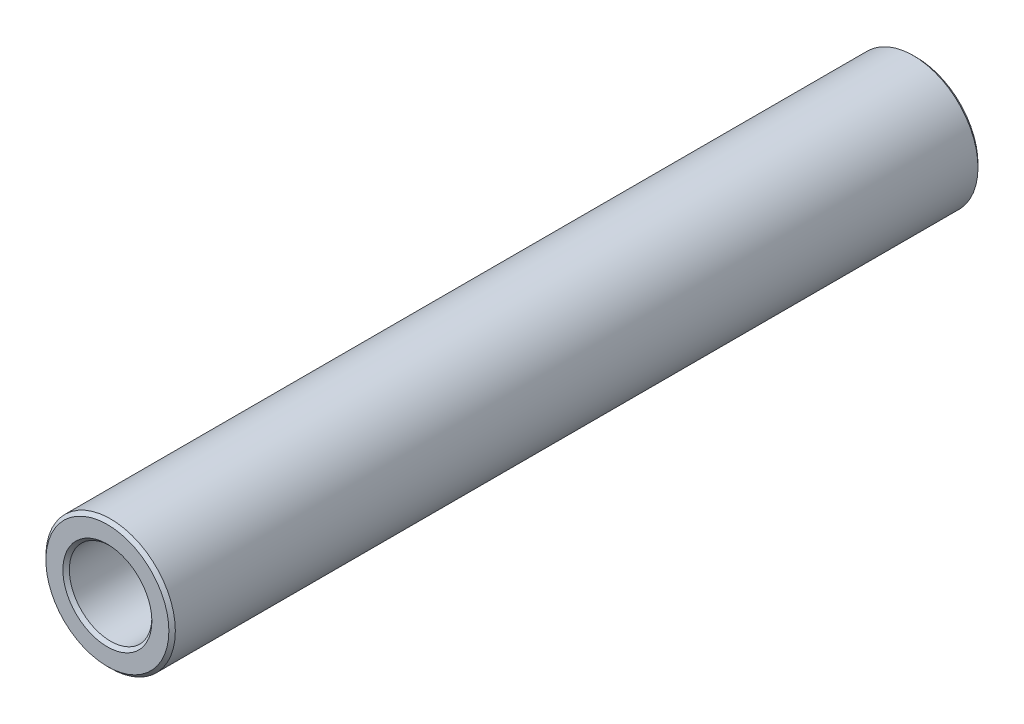
ISO-10303-21;
HEADER;
FILE_DESCRIPTION(('STEP AP214'),'2;1');
FILE_NAME('part.step','',(''),(''),'','','');
FILE_SCHEMA(('AUTOMOTIVE_DESIGN { 1 0 10303 214 1 1 1 1 }'));
ENDSEC;
DATA;
#1=APPLICATION_CONTEXT('core data for automotive mechanical design processes');
#2=APPLICATION_PROTOCOL_DEFINITION('international standard','automotive_design',2000,#1);
#3=PRODUCT_CONTEXT('',#1,'mechanical');
#4=PRODUCT('Part','Part','',(#3));
#5=PRODUCT_RELATED_PRODUCT_CATEGORY('part','',(#4));
#6=PRODUCT_DEFINITION_FORMATION('','',#4);
#7=PRODUCT_DEFINITION_CONTEXT('part definition',#1,'design');
#8=PRODUCT_DEFINITION('design','',#6,#7);
#9=PRODUCT_DEFINITION_SHAPE('','',#8);
#10=(LENGTH_UNIT() NAMED_UNIT(*) SI_UNIT(.MILLI.,.METRE.));
#11=(NAMED_UNIT(*) PLANE_ANGLE_UNIT() SI_UNIT($,.RADIAN.));
#12=(NAMED_UNIT(*) SI_UNIT($,.STERADIAN.) SOLID_ANGLE_UNIT());
#13=UNCERTAINTY_MEASURE_WITH_UNIT(LENGTH_MEASURE(1.E-05),#10,'distance_accuracy_value','');
#14=(GEOMETRIC_REPRESENTATION_CONTEXT(3) GLOBAL_UNCERTAINTY_ASSIGNED_CONTEXT((#13)) GLOBAL_UNIT_ASSIGNED_CONTEXT((#10,
#11,#12)) REPRESENTATION_CONTEXT('',''));
#15=CARTESIAN_POINT('',(0.,0.,0.));
#16=DIRECTION('',(0.,0.,1.));
#17=DIRECTION('',(1.,0.,0.));
#18=AXIS2_PLACEMENT_3D('',#15,#16,#17);
#19=CARTESIAN_POINT('',(0.,0.,50.));
#20=DIRECTION('',(0.,0.,1.));
#21=DIRECTION('',(1.,0.,0.));
#22=AXIS2_PLACEMENT_3D('',#19,#20,#21);
#23=PLANE('',#22);
#24=CARTESIAN_POINT('',(0.,0.,50.));
#25=DIRECTION('',(0.,0.,1.));
#26=DIRECTION('',(1.,0.,0.));
#27=AXIS2_PLACEMENT_3D('',#24,#25,#26);
#28=CIRCLE('',#27,2.75);
#29=CARTESIAN_POINT('',(2.75,0.,50.));
#30=VERTEX_POINT('',#29);
#31=EDGE_CURVE('E10',#30,#30,#28,.F.);
#32=ORIENTED_EDGE('',*,*,#31,.T.);
#33=EDGE_LOOP('',(#32));
#34=FACE_BOUND('',#33,.T.);
#35=CARTESIAN_POINT('',(0.,0.,50.));
#36=DIRECTION('',(0.,0.,1.));
#37=DIRECTION('',(1.,0.,0.));
#38=AXIS2_PLACEMENT_3D('',#35,#36,#37);
#39=CIRCLE('',#38,3.8);
#40=CARTESIAN_POINT('',(3.8,0.,50.));
#41=VERTEX_POINT('',#40);
#42=EDGE_CURVE('E37',#41,#41,#39,.T.);
#43=ORIENTED_EDGE('',*,*,#42,.T.);
#44=EDGE_LOOP('',(#43));
#45=FACE_BOUND('',#44,.T.);
#46=ADVANCED_FACE('F30',(#34,#45),#23,.T.);
#47=CARTESIAN_POINT('',(0.,0.,0.));
#48=DIRECTION('',(0.,0.,1.));
#49=DIRECTION('',(1.,0.,0.));
#50=AXIS2_PLACEMENT_3D('',#47,#48,#49);
#51=PLANE('',#50);
#52=CARTESIAN_POINT('',(0.,0.,0.));
#53=DIRECTION('',(0.,0.,1.));
#54=DIRECTION('',(1.,0.,0.));
#55=AXIS2_PLACEMENT_3D('',#52,#53,#54);
#56=CIRCLE('',#55,3.79999999999999);
#57=CARTESIAN_POINT('',(3.79999999999999,0.,0.));
#58=VERTEX_POINT('',#57);
#59=EDGE_CURVE('E50',#58,#58,#56,.F.);
#60=ORIENTED_EDGE('',*,*,#59,.T.);
#61=EDGE_LOOP('',(#60));
#62=FACE_BOUND('',#61,.T.);
#63=CARTESIAN_POINT('',(0.,0.,0.));
#64=DIRECTION('',(0.,0.,1.));
#65=DIRECTION('',(1.,0.,0.));
#66=AXIS2_PLACEMENT_3D('',#63,#64,#65);
#67=CIRCLE('',#66,2.75);
#68=CARTESIAN_POINT('',(2.75,0.,0.));
#69=VERTEX_POINT('',#68);
#70=EDGE_CURVE('E53',#69,#69,#67,.T.);
#71=ORIENTED_EDGE('',*,*,#70,.T.);
#72=EDGE_LOOP('',(#71));
#73=FACE_BOUND('',#72,.T.);
#74=ADVANCED_FACE('F74',(#62,#73),#51,.F.);
#75=CARTESIAN_POINT('',(0.,0.,50.));
#76=DIRECTION('',(0.,0.,-1.));
#77=DIRECTION('',(-1.,0.,0.));
#78=AXIS2_PLACEMENT_3D('',#75,#76,#77);
#79=CYLINDRICAL_SURFACE('',#78,4.);
#80=CARTESIAN_POINT('',(0.,0.,0.200000000000006));
#81=DIRECTION('',(0.,0.,1.));
#82=DIRECTION('',(1.,0.,0.));
#83=AXIS2_PLACEMENT_3D('',#80,#81,#82);
#84=CIRCLE('',#83,4.);
#85=CARTESIAN_POINT('',(4.,0.,0.200000000000006));
#86=VERTEX_POINT('',#85);
#87=EDGE_CURVE('E56',#86,#86,#84,.T.);
#88=ORIENTED_EDGE('',*,*,#87,.T.);
#89=EDGE_LOOP('',(#88));
#90=FACE_BOUND('',#89,.T.);
#91=CARTESIAN_POINT('',(0.,0.,49.8));
#92=DIRECTION('',(0.,0.,1.));
#93=DIRECTION('',(1.,0.,0.));
#94=AXIS2_PLACEMENT_3D('',#91,#92,#93);
#95=CIRCLE('',#94,4.);
#96=CARTESIAN_POINT('',(4.,0.,49.8));
#97=VERTEX_POINT('',#96);
#98=EDGE_CURVE('E59',#97,#97,#95,.F.);
#99=ORIENTED_EDGE('',*,*,#98,.T.);
#100=EDGE_LOOP('',(#99));
#101=FACE_BOUND('',#100,.T.);
#102=ADVANCED_FACE('F63',(#90,#101),#79,.T.);
#103=CARTESIAN_POINT('',(0.,0.,50.));
#104=DIRECTION('',(0.,0.,-1.));
#105=DIRECTION('',(-1.,0.,0.));
#106=AXIS2_PLACEMENT_3D('',#103,#104,#105);
#107=CYLINDRICAL_SURFACE('',#106,2.55);
#108=CARTESIAN_POINT('',(0.,0.,0.199999999999999));
#109=DIRECTION('',(0.,0.,1.));
#110=DIRECTION('',(1.,0.,0.));
#111=AXIS2_PLACEMENT_3D('',#108,#109,#110);
#112=CIRCLE('',#111,2.55);
#113=CARTESIAN_POINT('',(2.55,0.,0.199999999999999));
#114=VERTEX_POINT('',#113);
#115=EDGE_CURVE('E41',#114,#114,#112,.F.);
#116=ORIENTED_EDGE('',*,*,#115,.T.);
#117=EDGE_LOOP('',(#116));
#118=FACE_BOUND('',#117,.T.);
#119=CARTESIAN_POINT('',(0.,0.,49.8));
#120=DIRECTION('',(0.,0.,1.));
#121=DIRECTION('',(1.,0.,0.));
#122=AXIS2_PLACEMENT_3D('',#119,#120,#121);
#123=CIRCLE('',#122,2.55);
#124=CARTESIAN_POINT('',(2.55,0.,49.8));
#125=VERTEX_POINT('',#124);
#126=EDGE_CURVE('E45',#125,#125,#123,.T.);
#127=ORIENTED_EDGE('',*,*,#126,.T.);
#128=EDGE_LOOP('',(#127));
#129=FACE_BOUND('',#128,.T.);
#130=ADVANCED_FACE('F82',(#118,#129),#107,.F.);
#131=CARTESIAN_POINT('',(0.,0.,0.200000000000006));
#132=DIRECTION('',(0.,0.,1.));
#133=DIRECTION('',(1.,0.,0.));
#134=AXIS2_PLACEMENT_3D('',#131,#132,#133);
#135=CONICAL_SURFACE('',#134,4.,0.785398163397457);
#136=ORIENTED_EDGE('',*,*,#59,.F.);
#137=EDGE_LOOP('',(#136));
#138=FACE_BOUND('',#137,.T.);
#139=ORIENTED_EDGE('',*,*,#87,.F.);
#140=EDGE_LOOP('',(#139));
#141=FACE_BOUND('',#140,.T.);
#142=ADVANCED_FACE('F87',(#138,#141),#135,.T.);
#143=CARTESIAN_POINT('',(0.,0.,0.));
#144=DIRECTION('',(0.,0.,-1.));
#145=DIRECTION('',(-1.,0.,0.));
#146=AXIS2_PLACEMENT_3D('',#143,#144,#145);
#147=CONICAL_SURFACE('',#146,2.75,0.785398163397441);
#148=ORIENTED_EDGE('',*,*,#115,.F.);
#149=EDGE_LOOP('',(#148));
#150=FACE_BOUND('',#149,.T.);
#151=ORIENTED_EDGE('',*,*,#70,.F.);
#152=EDGE_LOOP('',(#151));
#153=FACE_BOUND('',#152,.T.);
#154=ADVANCED_FACE('F71',(#150,#153),#147,.F.);
#155=CARTESIAN_POINT('',(0.,0.,49.8));
#156=DIRECTION('',(0.,0.,1.));
#157=DIRECTION('',(1.,0.,0.));
#158=AXIS2_PLACEMENT_3D('',#155,#156,#157);
#159=CONICAL_SURFACE('',#158,2.55,0.785398163397441);
#160=ORIENTED_EDGE('',*,*,#31,.F.);
#161=EDGE_LOOP('',(#160));
#162=FACE_BOUND('',#161,.T.);
#163=ORIENTED_EDGE('',*,*,#126,.F.);
#164=EDGE_LOOP('',(#163));
#165=FACE_BOUND('',#164,.T.);
#166=ADVANCED_FACE('F67',(#162,#165),#159,.F.);
#167=CARTESIAN_POINT('',(0.,0.,50.));
#168=DIRECTION('',(0.,0.,-1.));
#169=DIRECTION('',(-1.,0.,0.));
#170=AXIS2_PLACEMENT_3D('',#167,#168,#169);
#171=CONICAL_SURFACE('',#170,3.8,0.78539816339744);
#172=ORIENTED_EDGE('',*,*,#98,.F.);
#173=EDGE_LOOP('',(#172));
#174=FACE_BOUND('',#173,.T.);
#175=ORIENTED_EDGE('',*,*,#42,.F.);
#176=EDGE_LOOP('',(#175));
#177=FACE_BOUND('',#176,.T.);
#178=ADVANCED_FACE('F32',(#174,#177),#171,.T.);
#179=CLOSED_SHELL('',(#46,#74,#102,#130,#142,#154,#166,#178));
#180=MANIFOLD_SOLID_BREP('B2',#179);
#181=ADVANCED_BREP_SHAPE_REPRESENTATION('',(#18,#180),#14);
#182=SHAPE_DEFINITION_REPRESENTATION(#9,#181);
ENDSEC;
END-ISO-10303-21;
